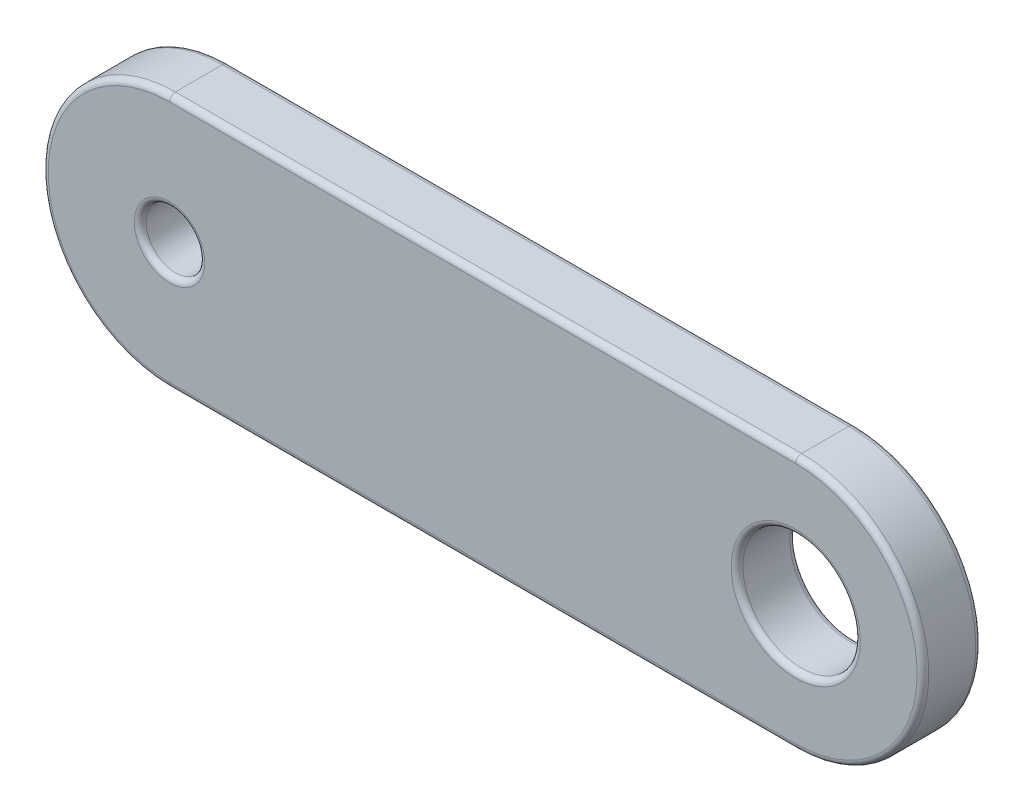
ISO-10303-21;
HEADER;
FILE_DESCRIPTION(('STEP AP214'),'2;1');
FILE_NAME('part.step','',(''),(''),'','','');
FILE_SCHEMA(('AUTOMOTIVE_DESIGN { 1 0 10303 214 1 1 1 1 }'));
ENDSEC;
DATA;
#1=APPLICATION_CONTEXT('core data for automotive mechanical design processes');
#2=APPLICATION_PROTOCOL_DEFINITION('international standard','automotive_design',2000,#1);
#3=PRODUCT_CONTEXT('',#1,'mechanical');
#4=PRODUCT('Part','Part','',(#3));
#5=PRODUCT_RELATED_PRODUCT_CATEGORY('part','',(#4));
#6=PRODUCT_DEFINITION_FORMATION('','',#4);
#7=PRODUCT_DEFINITION_CONTEXT('part definition',#1,'design');
#8=PRODUCT_DEFINITION('design','',#6,#7);
#9=PRODUCT_DEFINITION_SHAPE('','',#8);
#10=(LENGTH_UNIT() NAMED_UNIT(*) SI_UNIT(.MILLI.,.METRE.));
#11=(NAMED_UNIT(*) PLANE_ANGLE_UNIT() SI_UNIT($,.RADIAN.));
#12=(NAMED_UNIT(*) SI_UNIT($,.STERADIAN.) SOLID_ANGLE_UNIT());
#13=UNCERTAINTY_MEASURE_WITH_UNIT(LENGTH_MEASURE(1.E-05),#10,'distance_accuracy_value','');
#14=(GEOMETRIC_REPRESENTATION_CONTEXT(3) GLOBAL_UNCERTAINTY_ASSIGNED_CONTEXT((#13)) GLOBAL_UNIT_ASSIGNED_CONTEXT((#10,
#11,#12)) REPRESENTATION_CONTEXT('',''));
#15=CARTESIAN_POINT('',(0.,0.,0.));
#16=DIRECTION('',(0.,0.,1.));
#17=DIRECTION('',(1.,0.,0.));
#18=AXIS2_PLACEMENT_3D('',#15,#16,#17);
#19=CARTESIAN_POINT('',(-8.,0.,0.75));
#20=DIRECTION('',(0.,0.,1.));
#21=DIRECTION('',(1.,0.,0.));
#22=AXIS2_PLACEMENT_3D('',#19,#20,#21);
#23=PLANE('',#22);
#24=CARTESIAN_POINT('',(8.,0.,0.75));
#25=DIRECTION('',(0.,0.,1.));
#26=DIRECTION('',(1.,0.,0.));
#27=AXIS2_PLACEMENT_3D('',#24,#25,#26);
#28=CIRCLE('',#27,1.65);
#29=CARTESIAN_POINT('',(9.65,0.,0.75));
#30=VERTEX_POINT('',#29);
#31=EDGE_CURVE('E11',#30,#30,#28,.F.);
#32=ORIENTED_EDGE('',*,*,#31,.T.);
#33=EDGE_LOOP('',(#32));
#34=FACE_BOUND('',#33,.T.);
#35=CARTESIAN_POINT('',(8.,0.,0.75));
#36=DIRECTION('',(0.,0.,1.));
#37=DIRECTION('',(1.,0.,0.));
#38=AXIS2_PLACEMENT_3D('',#35,#36,#37);
#39=CIRCLE('',#38,3.1);
#40=CARTESIAN_POINT('',(8.,-3.1,0.75));
#41=VERTEX_POINT('',#40);
#42=CARTESIAN_POINT('',(8.,3.1,0.75));
#43=VERTEX_POINT('',#42);
#44=EDGE_CURVE('E50',#41,#43,#39,.T.);
#45=ORIENTED_EDGE('',*,*,#44,.T.);
#46=DIRECTION('',(-1.,0.,0.));
#47=VECTOR('',#46,1.);
#48=CARTESIAN_POINT('',(-8.,3.1,0.75));
#49=LINE('',#48,#47);
#50=CARTESIAN_POINT('',(-8.,3.1,0.75));
#51=VERTEX_POINT('',#50);
#52=EDGE_CURVE('E42',#43,#51,#49,.T.);
#53=ORIENTED_EDGE('',*,*,#52,.T.);
#54=CARTESIAN_POINT('',(-8.,0.,0.75));
#55=DIRECTION('',(0.,0.,1.));
#56=DIRECTION('',(1.,0.,0.));
#57=AXIS2_PLACEMENT_3D('',#54,#55,#56);
#58=CIRCLE('',#57,3.1);
#59=CARTESIAN_POINT('',(-8.,-3.1,0.75));
#60=VERTEX_POINT('',#59);
#61=EDGE_CURVE('E166',#51,#60,#58,.T.);
#62=ORIENTED_EDGE('',*,*,#61,.T.);
#63=DIRECTION('',(1.,0.,0.));
#64=VECTOR('',#63,1.);
#65=CARTESIAN_POINT('',(8.,-3.1,0.75));
#66=LINE('',#65,#64);
#67=EDGE_CURVE('E55',#60,#41,#66,.T.);
#68=ORIENTED_EDGE('',*,*,#67,.T.);
#69=EDGE_LOOP('',(#45,#53,#62,#68));
#70=FACE_BOUND('',#69,.T.);
#71=CARTESIAN_POINT('',(-8.,0.,0.75));
#72=DIRECTION('',(0.,0.,1.));
#73=DIRECTION('',(1.,0.,0.));
#74=AXIS2_PLACEMENT_3D('',#71,#72,#73);
#75=CIRCLE('',#74,0.9);
#76=CARTESIAN_POINT('',(-7.1,0.,0.75));
#77=VERTEX_POINT('',#76);
#78=EDGE_CURVE('E163',#77,#77,#75,.F.);
#79=ORIENTED_EDGE('',*,*,#78,.T.);
#80=EDGE_LOOP('',(#79));
#81=FACE_BOUND('',#80,.T.);
#82=ADVANCED_FACE('F33',(#34,#70,#81),#23,.T.);
#83=CARTESIAN_POINT('',(-8.,0.,-0.75));
#84=DIRECTION('',(0.,0.,1.));
#85=DIRECTION('',(1.,0.,0.));
#86=AXIS2_PLACEMENT_3D('',#83,#84,#85);
#87=PLANE('',#86);
#88=CARTESIAN_POINT('',(8.,0.,-0.75));
#89=DIRECTION('',(0.,0.,1.));
#90=DIRECTION('',(1.,0.,0.));
#91=AXIS2_PLACEMENT_3D('',#88,#89,#90);
#92=CIRCLE('',#91,1.65);
#93=CARTESIAN_POINT('',(9.65,0.,-0.75));
#94=VERTEX_POINT('',#93);
#95=EDGE_CURVE('E128',#94,#94,#92,.T.);
#96=ORIENTED_EDGE('',*,*,#95,.T.);
#97=EDGE_LOOP('',(#96));
#98=FACE_BOUND('',#97,.T.);
#99=CARTESIAN_POINT('',(8.,0.,-0.75));
#100=DIRECTION('',(0.,0.,1.));
#101=DIRECTION('',(1.,0.,0.));
#102=AXIS2_PLACEMENT_3D('',#99,#100,#101);
#103=CIRCLE('',#102,3.1);
#104=CARTESIAN_POINT('',(8.,3.1,-0.75));
#105=VERTEX_POINT('',#104);
#106=CARTESIAN_POINT('',(8.,-3.1,-0.75));
#107=VERTEX_POINT('',#106);
#108=EDGE_CURVE('E127',#105,#107,#103,.F.);
#109=ORIENTED_EDGE('',*,*,#108,.T.);
#110=DIRECTION('',(1.,0.,0.));
#111=VECTOR('',#110,1.);
#112=CARTESIAN_POINT('',(-8.,-3.1,-0.75));
#113=LINE('',#112,#111);
#114=CARTESIAN_POINT('',(-8.,-3.1,-0.75));
#115=VERTEX_POINT('',#114);
#116=EDGE_CURVE('E105',#107,#115,#113,.F.);
#117=ORIENTED_EDGE('',*,*,#116,.T.);
#118=CARTESIAN_POINT('',(-8.,0.,-0.75));
#119=DIRECTION('',(0.,0.,1.));
#120=DIRECTION('',(1.,0.,0.));
#121=AXIS2_PLACEMENT_3D('',#118,#119,#120);
#122=CIRCLE('',#121,3.1);
#123=CARTESIAN_POINT('',(-8.,3.1,-0.75));
#124=VERTEX_POINT('',#123);
#125=EDGE_CURVE('E115',#115,#124,#122,.F.);
#126=ORIENTED_EDGE('',*,*,#125,.T.);
#127=DIRECTION('',(-1.,0.,0.));
#128=VECTOR('',#127,1.);
#129=CARTESIAN_POINT('',(-8.,3.1,-0.75));
#130=LINE('',#129,#128);
#131=EDGE_CURVE('E121',#124,#105,#130,.F.);
#132=ORIENTED_EDGE('',*,*,#131,.T.);
#133=EDGE_LOOP('',(#109,#117,#126,#132));
#134=FACE_BOUND('',#133,.T.);
#135=CARTESIAN_POINT('',(-8.,0.,-0.75));
#136=DIRECTION('',(0.,0.,1.));
#137=DIRECTION('',(1.,0.,0.));
#138=AXIS2_PLACEMENT_3D('',#135,#136,#137);
#139=CIRCLE('',#138,0.9);
#140=CARTESIAN_POINT('',(-7.1,0.,-0.75));
#141=VERTEX_POINT('',#140);
#142=EDGE_CURVE('E122',#141,#141,#139,.T.);
#143=ORIENTED_EDGE('',*,*,#142,.T.);
#144=EDGE_LOOP('',(#143));
#145=FACE_BOUND('',#144,.T.);
#146=ADVANCED_FACE('F124',(#98,#134,#145),#87,.F.);
#147=CARTESIAN_POINT('',(-8.,0.,0.75));
#148=DIRECTION('',(0.,0.,-1.));
#149=DIRECTION('',(-1.,0.,0.));
#150=AXIS2_PLACEMENT_3D('',#147,#148,#149);
#151=CYLINDRICAL_SURFACE('',#150,3.25);
#152=DIRECTION('',(0.,0.,-1.));
#153=VECTOR('',#152,1.);
#154=CARTESIAN_POINT('',(-8.,3.25,0.75));
#155=LINE('',#154,#153);
#156=CARTESIAN_POINT('',(-8.,3.25,0.6));
#157=VERTEX_POINT('',#156);
#158=CARTESIAN_POINT('',(-8.,3.25,-0.6));
#159=VERTEX_POINT('',#158);
#160=EDGE_CURVE('E175',#157,#159,#155,.T.);
#161=ORIENTED_EDGE('',*,*,#160,.T.);
#162=CARTESIAN_POINT('',(-8.,0.,-0.6));
#163=DIRECTION('',(0.,0.,1.));
#164=DIRECTION('',(1.,0.,0.));
#165=AXIS2_PLACEMENT_3D('',#162,#163,#164);
#166=CIRCLE('',#165,3.25);
#167=CARTESIAN_POINT('',(-8.,-3.25,-0.6));
#168=VERTEX_POINT('',#167);
#169=EDGE_CURVE('E155',#159,#168,#166,.T.);
#170=ORIENTED_EDGE('',*,*,#169,.T.);
#171=DIRECTION('',(0.,0.,-1.));
#172=VECTOR('',#171,1.);
#173=CARTESIAN_POINT('',(-8.,-3.25,0.75));
#174=LINE('',#173,#172);
#175=CARTESIAN_POINT('',(-8.,-3.25,0.6));
#176=VERTEX_POINT('',#175);
#177=EDGE_CURVE('E197',#176,#168,#174,.T.);
#178=ORIENTED_EDGE('',*,*,#177,.F.);
#179=CARTESIAN_POINT('',(-8.,0.,0.6));
#180=DIRECTION('',(0.,0.,1.));
#181=DIRECTION('',(1.,0.,0.));
#182=AXIS2_PLACEMENT_3D('',#179,#180,#181);
#183=CIRCLE('',#182,3.25);
#184=EDGE_CURVE('E153',#176,#157,#183,.F.);
#185=ORIENTED_EDGE('',*,*,#184,.T.);
#186=EDGE_LOOP('',(#161,#170,#178,#185));
#187=FACE_BOUND('',#186,.T.);
#188=ADVANCED_FACE('F202',(#187),#151,.T.);
#189=CARTESIAN_POINT('',(-8.,-3.25,0.75));
#190=DIRECTION('',(0.,1.,0.));
#191=DIRECTION('',(-1.,0.,0.));
#192=AXIS2_PLACEMENT_3D('',#189,#190,#191);
#193=PLANE('',#192);
#194=ORIENTED_EDGE('',*,*,#177,.T.);
#195=DIRECTION('',(1.,0.,0.));
#196=VECTOR('',#195,1.);
#197=CARTESIAN_POINT('',(-8.,-3.25,-0.6));
#198=LINE('',#197,#196);
#199=CARTESIAN_POINT('',(8.,-3.25,-0.6));
#200=VERTEX_POINT('',#199);
#201=EDGE_CURVE('E108',#168,#200,#198,.T.);
#202=ORIENTED_EDGE('',*,*,#201,.T.);
#203=DIRECTION('',(0.,0.,-1.));
#204=VECTOR('',#203,1.);
#205=CARTESIAN_POINT('',(8.,-3.25,0.75));
#206=LINE('',#205,#204);
#207=CARTESIAN_POINT('',(8.,-3.25,0.6));
#208=VERTEX_POINT('',#207);
#209=EDGE_CURVE('E199',#208,#200,#206,.T.);
#210=ORIENTED_EDGE('',*,*,#209,.F.);
#211=DIRECTION('',(1.,0.,0.));
#212=VECTOR('',#211,1.);
#213=CARTESIAN_POINT('',(-8.,-3.25,0.6));
#214=LINE('',#213,#212);
#215=EDGE_CURVE('E141',#208,#176,#214,.F.);
#216=ORIENTED_EDGE('',*,*,#215,.T.);
#217=EDGE_LOOP('',(#194,#202,#210,#216));
#218=FACE_BOUND('',#217,.T.);
#219=ADVANCED_FACE('F196',(#218),#193,.F.);
#220=CARTESIAN_POINT('',(8.,0.,0.75));
#221=DIRECTION('',(0.,0.,-1.));
#222=DIRECTION('',(-1.,0.,0.));
#223=AXIS2_PLACEMENT_3D('',#220,#221,#222);
#224=CYLINDRICAL_SURFACE('',#223,3.25);
#225=ORIENTED_EDGE('',*,*,#209,.T.);
#226=CARTESIAN_POINT('',(8.,0.,-0.6));
#227=DIRECTION('',(0.,0.,1.));
#228=DIRECTION('',(1.,0.,0.));
#229=AXIS2_PLACEMENT_3D('',#226,#227,#228);
#230=CIRCLE('',#229,3.25);
#231=CARTESIAN_POINT('',(8.,3.25,-0.6));
#232=VERTEX_POINT('',#231);
#233=EDGE_CURVE('E146',#200,#232,#230,.T.);
#234=ORIENTED_EDGE('',*,*,#233,.T.);
#235=DIRECTION('',(0.,0.,-1.));
#236=VECTOR('',#235,1.);
#237=CARTESIAN_POINT('',(8.,3.25,0.75));
#238=LINE('',#237,#236);
#239=CARTESIAN_POINT('',(8.,3.25,0.6));
#240=VERTEX_POINT('',#239);
#241=EDGE_CURVE('E207',#240,#232,#238,.T.);
#242=ORIENTED_EDGE('',*,*,#241,.F.);
#243=CARTESIAN_POINT('',(8.,0.,0.6));
#244=DIRECTION('',(0.,0.,1.));
#245=DIRECTION('',(1.,0.,0.));
#246=AXIS2_PLACEMENT_3D('',#243,#244,#245);
#247=CIRCLE('',#246,3.25);
#248=EDGE_CURVE('E144',#240,#208,#247,.F.);
#249=ORIENTED_EDGE('',*,*,#248,.T.);
#250=EDGE_LOOP('',(#225,#234,#242,#249));
#251=FACE_BOUND('',#250,.T.);
#252=ADVANCED_FACE('F220',(#251),#224,.T.);
#253=CARTESIAN_POINT('',(-8.,3.25,0.75));
#254=DIRECTION('',(0.,-1.,0.));
#255=DIRECTION('',(1.,0.,0.));
#256=AXIS2_PLACEMENT_3D('',#253,#254,#255);
#257=PLANE('',#256);
#258=ORIENTED_EDGE('',*,*,#241,.T.);
#259=DIRECTION('',(-1.,0.,0.));
#260=VECTOR('',#259,1.);
#261=CARTESIAN_POINT('',(-8.,3.25,-0.6));
#262=LINE('',#261,#260);
#263=EDGE_CURVE('E151',#232,#159,#262,.T.);
#264=ORIENTED_EDGE('',*,*,#263,.T.);
#265=ORIENTED_EDGE('',*,*,#160,.F.);
#266=DIRECTION('',(-1.,0.,0.));
#267=VECTOR('',#266,1.);
#268=CARTESIAN_POINT('',(8.,3.25,0.6));
#269=LINE('',#268,#267);
#270=EDGE_CURVE('E148',#157,#240,#269,.F.);
#271=ORIENTED_EDGE('',*,*,#270,.T.);
#272=EDGE_LOOP('',(#258,#264,#265,#271));
#273=FACE_BOUND('',#272,.T.);
#274=ADVANCED_FACE('F224',(#273),#257,.F.);
#275=CARTESIAN_POINT('',(-8.,0.,0.75));
#276=DIRECTION('',(0.,0.,-1.));
#277=DIRECTION('',(-1.,0.,0.));
#278=AXIS2_PLACEMENT_3D('',#275,#276,#277);
#279=CYLINDRICAL_SURFACE('',#278,0.75);
#280=CARTESIAN_POINT('',(-8.,0.,-0.6));
#281=DIRECTION('',(0.,0.,1.));
#282=DIRECTION('',(1.,0.,0.));
#283=AXIS2_PLACEMENT_3D('',#280,#281,#282);
#284=CIRCLE('',#283,0.75);
#285=CARTESIAN_POINT('',(-7.25,0.,-0.6));
#286=VERTEX_POINT('',#285);
#287=EDGE_CURVE('E160',#286,#286,#284,.F.);
#288=ORIENTED_EDGE('',*,*,#287,.T.);
#289=EDGE_LOOP('',(#288));
#290=FACE_BOUND('',#289,.T.);
#291=CARTESIAN_POINT('',(-8.,0.,0.6));
#292=DIRECTION('',(0.,0.,1.));
#293=DIRECTION('',(1.,0.,0.));
#294=AXIS2_PLACEMENT_3D('',#291,#292,#293);
#295=CIRCLE('',#294,0.75);
#296=CARTESIAN_POINT('',(-7.25,0.,0.6));
#297=VERTEX_POINT('',#296);
#298=EDGE_CURVE('E157',#297,#297,#295,.T.);
#299=ORIENTED_EDGE('',*,*,#298,.T.);
#300=EDGE_LOOP('',(#299));
#301=FACE_BOUND('',#300,.T.);
#302=ADVANCED_FACE('F240',(#290,#301),#279,.F.);
#303=CARTESIAN_POINT('',(8.,0.,0.75));
#304=DIRECTION('',(0.,0.,-1.));
#305=DIRECTION('',(-1.,0.,0.));
#306=AXIS2_PLACEMENT_3D('',#303,#304,#305);
#307=CYLINDRICAL_SURFACE('',#306,1.5);
#308=CARTESIAN_POINT('',(8.,0.,-0.6));
#309=DIRECTION('',(0.,0.,1.));
#310=DIRECTION('',(1.,0.,0.));
#311=AXIS2_PLACEMENT_3D('',#308,#309,#310);
#312=CIRCLE('',#311,1.5);
#313=CARTESIAN_POINT('',(9.5,0.,-0.6));
#314=VERTEX_POINT('',#313);
#315=EDGE_CURVE('E138',#314,#314,#312,.F.);
#316=ORIENTED_EDGE('',*,*,#315,.T.);
#317=EDGE_LOOP('',(#316));
#318=FACE_BOUND('',#317,.T.);
#319=CARTESIAN_POINT('',(8.,0.,0.6));
#320=DIRECTION('',(0.,0.,1.));
#321=DIRECTION('',(1.,0.,0.));
#322=AXIS2_PLACEMENT_3D('',#319,#320,#321);
#323=CIRCLE('',#322,1.5);
#324=CARTESIAN_POINT('',(9.5,0.,0.6));
#325=VERTEX_POINT('',#324);
#326=EDGE_CURVE('E131',#325,#325,#323,.T.);
#327=ORIENTED_EDGE('',*,*,#326,.T.);
#328=EDGE_LOOP('',(#327));
#329=FACE_BOUND('',#328,.T.);
#330=ADVANCED_FACE('F242',(#318,#329),#307,.F.);
#331=CARTESIAN_POINT('',(8.,0.,-0.6));
#332=DIRECTION('',(0.,0.,1.));
#333=DIRECTION('',(1.,0.,0.));
#334=AXIS2_PLACEMENT_3D('',#331,#332,#333);
#335=TOROIDAL_SURFACE('',#334,1.65,0.15);
#336=ORIENTED_EDGE('',*,*,#315,.F.);
#337=EDGE_LOOP('',(#336));
#338=FACE_BOUND('',#337,.T.);
#339=ORIENTED_EDGE('',*,*,#95,.F.);
#340=EDGE_LOOP('',(#339));
#341=FACE_BOUND('',#340,.T.);
#342=ADVANCED_FACE('F249',(#338,#341),#335,.T.);
#343=CARTESIAN_POINT('',(-8.,3.1,-0.6));
#344=DIRECTION('',(-1.,0.,0.));
#345=DIRECTION('',(0.,-1.,0.));
#346=AXIS2_PLACEMENT_3D('',#343,#344,#345);
#347=CYLINDRICAL_SURFACE('',#346,0.15);
#348=CARTESIAN_POINT('',(8.,3.1,-0.6));
#349=DIRECTION('',(1.,0.,0.));
#350=DIRECTION('',(0.,0.,-1.));
#351=AXIS2_PLACEMENT_3D('',#348,#349,#350);
#352=CIRCLE('',#351,0.15);
#353=EDGE_CURVE('E111',#105,#232,#352,.T.);
#354=ORIENTED_EDGE('',*,*,#353,.F.);
#355=ORIENTED_EDGE('',*,*,#131,.F.);
#356=CARTESIAN_POINT('',(-8.,3.1,-0.6));
#357=DIRECTION('',(-1.,0.,0.));
#358=DIRECTION('',(0.,0.,1.));
#359=AXIS2_PLACEMENT_3D('',#356,#357,#358);
#360=CIRCLE('',#359,0.15);
#361=EDGE_CURVE('E118',#159,#124,#360,.T.);
#362=ORIENTED_EDGE('',*,*,#361,.F.);
#363=ORIENTED_EDGE('',*,*,#263,.F.);
#364=EDGE_LOOP('',(#354,#355,#362,#363));
#365=FACE_BOUND('',#364,.T.);
#366=ADVANCED_FACE('F213',(#365),#347,.T.);
#367=CARTESIAN_POINT('',(-8.,0.,-0.6));
#368=DIRECTION('',(0.,0.,1.));
#369=DIRECTION('',(1.,0.,0.));
#370=AXIS2_PLACEMENT_3D('',#367,#368,#369);
#371=TOROIDAL_SURFACE('',#370,3.1,0.15);
#372=ORIENTED_EDGE('',*,*,#361,.T.);
#373=ORIENTED_EDGE('',*,*,#125,.F.);
#374=CARTESIAN_POINT('',(-8.,-3.1,-0.6));
#375=DIRECTION('',(1.,0.,0.));
#376=DIRECTION('',(0.,0.,-1.));
#377=AXIS2_PLACEMENT_3D('',#374,#375,#376);
#378=CIRCLE('',#377,0.15);
#379=EDGE_CURVE('E101',#168,#115,#378,.T.);
#380=ORIENTED_EDGE('',*,*,#379,.F.);
#381=ORIENTED_EDGE('',*,*,#169,.F.);
#382=EDGE_LOOP('',(#372,#373,#380,#381));
#383=FACE_BOUND('',#382,.T.);
#384=ADVANCED_FACE('F116',(#383),#371,.T.);
#385=CARTESIAN_POINT('',(8.,0.,-0.6));
#386=DIRECTION('',(0.,0.,1.));
#387=DIRECTION('',(1.,0.,0.));
#388=AXIS2_PLACEMENT_3D('',#385,#386,#387);
#389=TOROIDAL_SURFACE('',#388,3.1,0.15);
#390=ORIENTED_EDGE('',*,*,#353,.T.);
#391=ORIENTED_EDGE('',*,*,#233,.F.);
#392=CARTESIAN_POINT('',(8.,-3.1,-0.6));
#393=DIRECTION('',(-1.,0.,0.));
#394=DIRECTION('',(0.,0.,1.));
#395=AXIS2_PLACEMENT_3D('',#392,#393,#394);
#396=CIRCLE('',#395,0.15);
#397=EDGE_CURVE('E112',#107,#200,#396,.T.);
#398=ORIENTED_EDGE('',*,*,#397,.F.);
#399=ORIENTED_EDGE('',*,*,#108,.F.);
#400=EDGE_LOOP('',(#390,#391,#398,#399));
#401=FACE_BOUND('',#400,.T.);
#402=ADVANCED_FACE('F216',(#401),#389,.T.);
#403=CARTESIAN_POINT('',(-8.,-3.1,-0.6));
#404=DIRECTION('',(1.,0.,0.));
#405=DIRECTION('',(0.,1.,0.));
#406=AXIS2_PLACEMENT_3D('',#403,#404,#405);
#407=CYLINDRICAL_SURFACE('',#406,0.15);
#408=ORIENTED_EDGE('',*,*,#379,.T.);
#409=ORIENTED_EDGE('',*,*,#116,.F.);
#410=ORIENTED_EDGE('',*,*,#397,.T.);
#411=ORIENTED_EDGE('',*,*,#201,.F.);
#412=EDGE_LOOP('',(#408,#409,#410,#411));
#413=FACE_BOUND('',#412,.T.);
#414=ADVANCED_FACE('F103',(#413),#407,.T.);
#415=CARTESIAN_POINT('',(-8.,0.,-0.6));
#416=DIRECTION('',(0.,0.,1.));
#417=DIRECTION('',(1.,0.,0.));
#418=AXIS2_PLACEMENT_3D('',#415,#416,#417);
#419=TOROIDAL_SURFACE('',#418,0.9,0.15);
#420=ORIENTED_EDGE('',*,*,#287,.F.);
#421=EDGE_LOOP('',(#420));
#422=FACE_BOUND('',#421,.T.);
#423=ORIENTED_EDGE('',*,*,#142,.F.);
#424=EDGE_LOOP('',(#423));
#425=FACE_BOUND('',#424,.T.);
#426=ADVANCED_FACE('F268',(#422,#425),#419,.T.);
#427=CARTESIAN_POINT('',(8.,0.,0.6));
#428=DIRECTION('',(0.,0.,1.));
#429=DIRECTION('',(1.,0.,0.));
#430=AXIS2_PLACEMENT_3D('',#427,#428,#429);
#431=TOROIDAL_SURFACE('',#430,1.65,0.15);
#432=ORIENTED_EDGE('',*,*,#31,.F.);
#433=EDGE_LOOP('',(#432));
#434=FACE_BOUND('',#433,.T.);
#435=ORIENTED_EDGE('',*,*,#326,.F.);
#436=EDGE_LOOP('',(#435));
#437=FACE_BOUND('',#436,.T.);
#438=ADVANCED_FACE('F277',(#434,#437),#431,.T.);
#439=CARTESIAN_POINT('',(-8.,-3.1,0.6));
#440=DIRECTION('',(-1.,0.,0.));
#441=DIRECTION('',(0.,-1.,0.));
#442=AXIS2_PLACEMENT_3D('',#439,#440,#441);
#443=CYLINDRICAL_SURFACE('',#442,0.15);
#444=CARTESIAN_POINT('',(-8.,-3.1,0.6));
#445=DIRECTION('',(-1.,0.,0.));
#446=DIRECTION('',(0.,0.,1.));
#447=AXIS2_PLACEMENT_3D('',#444,#445,#446);
#448=CIRCLE('',#447,0.15);
#449=EDGE_CURVE('E179',#176,#60,#448,.T.);
#450=ORIENTED_EDGE('',*,*,#449,.F.);
#451=ORIENTED_EDGE('',*,*,#215,.F.);
#452=CARTESIAN_POINT('',(8.,-3.1,0.6));
#453=DIRECTION('',(1.,0.,0.));
#454=DIRECTION('',(0.,0.,-1.));
#455=AXIS2_PLACEMENT_3D('',#452,#453,#454);
#456=CIRCLE('',#455,0.15);
#457=EDGE_CURVE('E37',#41,#208,#456,.T.);
#458=ORIENTED_EDGE('',*,*,#457,.F.);
#459=ORIENTED_EDGE('',*,*,#67,.F.);
#460=EDGE_LOOP('',(#450,#451,#458,#459));
#461=FACE_BOUND('',#460,.T.);
#462=ADVANCED_FACE('F191',(#461),#443,.T.);
#463=CARTESIAN_POINT('',(8.,0.,0.6));
#464=DIRECTION('',(0.,0.,1.));
#465=DIRECTION('',(1.,0.,0.));
#466=AXIS2_PLACEMENT_3D('',#463,#464,#465);
#467=TOROIDAL_SURFACE('',#466,3.1,0.15);
#468=ORIENTED_EDGE('',*,*,#457,.T.);
#469=ORIENTED_EDGE('',*,*,#248,.F.);
#470=CARTESIAN_POINT('',(8.,3.1,0.6));
#471=DIRECTION('',(-1.,0.,0.));
#472=DIRECTION('',(0.,0.,1.));
#473=AXIS2_PLACEMENT_3D('',#470,#471,#472);
#474=CIRCLE('',#473,0.15);
#475=EDGE_CURVE('E178',#43,#240,#474,.T.);
#476=ORIENTED_EDGE('',*,*,#475,.F.);
#477=ORIENTED_EDGE('',*,*,#44,.F.);
#478=EDGE_LOOP('',(#468,#469,#476,#477));
#479=FACE_BOUND('',#478,.T.);
#480=ADVANCED_FACE('F188',(#479),#467,.T.);
#481=CARTESIAN_POINT('',(-8.,0.,0.6));
#482=DIRECTION('',(0.,0.,1.));
#483=DIRECTION('',(1.,0.,0.));
#484=AXIS2_PLACEMENT_3D('',#481,#482,#483);
#485=TOROIDAL_SURFACE('',#484,3.1,0.15);
#486=ORIENTED_EDGE('',*,*,#449,.T.);
#487=ORIENTED_EDGE('',*,*,#61,.F.);
#488=CARTESIAN_POINT('',(-8.,3.1,0.6));
#489=DIRECTION('',(1.,0.,0.));
#490=DIRECTION('',(0.,0.,-1.));
#491=AXIS2_PLACEMENT_3D('',#488,#489,#490);
#492=CIRCLE('',#491,0.15);
#493=EDGE_CURVE('E176',#157,#51,#492,.T.);
#494=ORIENTED_EDGE('',*,*,#493,.F.);
#495=ORIENTED_EDGE('',*,*,#184,.F.);
#496=EDGE_LOOP('',(#486,#487,#494,#495));
#497=FACE_BOUND('',#496,.T.);
#498=ADVANCED_FACE('F229',(#497),#485,.T.);
#499=CARTESIAN_POINT('',(-8.,3.1,0.6));
#500=DIRECTION('',(1.,0.,0.));
#501=DIRECTION('',(0.,1.,0.));
#502=AXIS2_PLACEMENT_3D('',#499,#500,#501);
#503=CYLINDRICAL_SURFACE('',#502,0.15);
#504=ORIENTED_EDGE('',*,*,#475,.T.);
#505=ORIENTED_EDGE('',*,*,#270,.F.);
#506=ORIENTED_EDGE('',*,*,#493,.T.);
#507=ORIENTED_EDGE('',*,*,#52,.F.);
#508=EDGE_LOOP('',(#504,#505,#506,#507));
#509=FACE_BOUND('',#508,.T.);
#510=ADVANCED_FACE('F227',(#509),#503,.T.);
#511=CARTESIAN_POINT('',(-8.,0.,0.6));
#512=DIRECTION('',(0.,0.,1.));
#513=DIRECTION('',(1.,0.,0.));
#514=AXIS2_PLACEMENT_3D('',#511,#512,#513);
#515=TOROIDAL_SURFACE('',#514,0.9,0.15);
#516=ORIENTED_EDGE('',*,*,#78,.F.);
#517=EDGE_LOOP('',(#516));
#518=FACE_BOUND('',#517,.T.);
#519=ORIENTED_EDGE('',*,*,#298,.F.);
#520=EDGE_LOOP('',(#519));
#521=FACE_BOUND('',#520,.T.);
#522=ADVANCED_FACE('F35',(#518,#521),#515,.T.);
#523=CLOSED_SHELL('',(#82,#146,#188,#219,#252,#274,#302,#330,#342,#366,#384,#402,#414,#426,#438,
#462,#480,#498,#510,#522));
#524=MANIFOLD_SOLID_BREP('B2',#523);
#525=ADVANCED_BREP_SHAPE_REPRESENTATION('',(#18,#524),#14);
#526=SHAPE_DEFINITION_REPRESENTATION(#9,#525);
ENDSEC;
END-ISO-10303-21;
